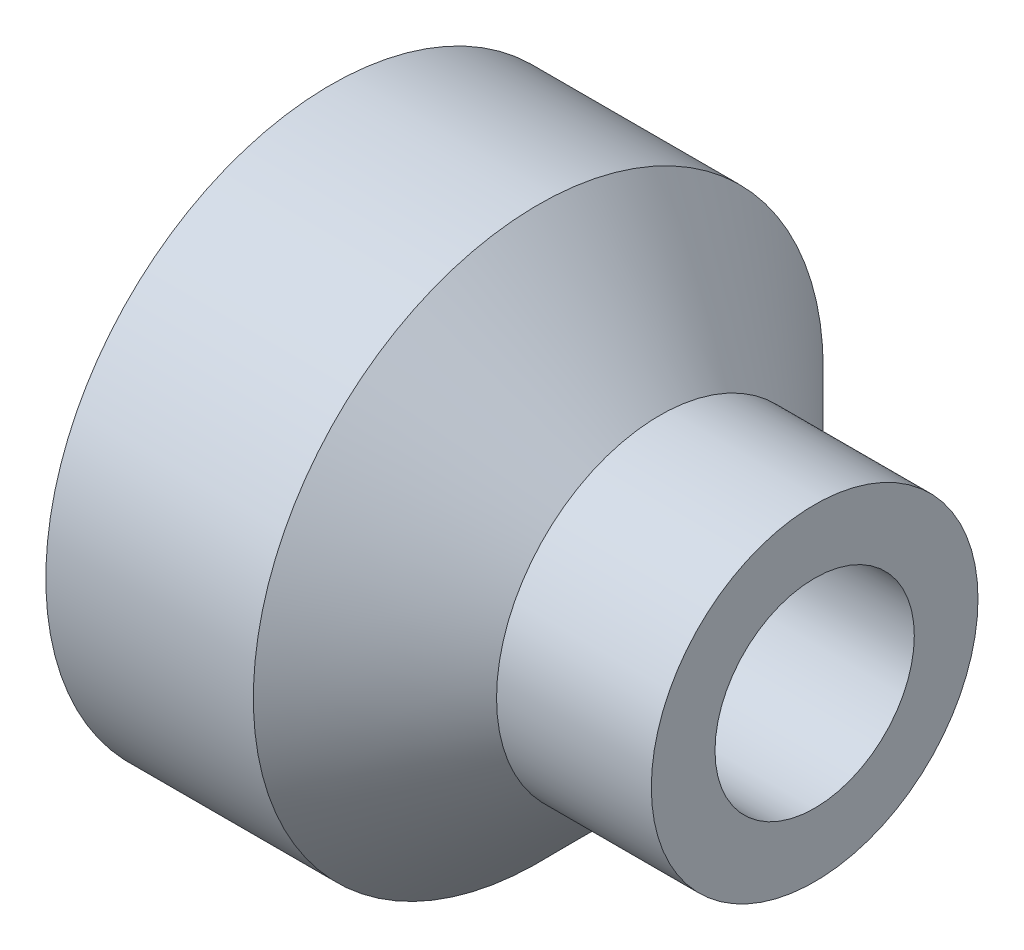
ISO-10303-21;
HEADER;
FILE_DESCRIPTION(('STEP AP214'),'2;1');
FILE_NAME('part.step','',(''),(''),'','','');
FILE_SCHEMA(('AUTOMOTIVE_DESIGN { 1 0 10303 214 1 1 1 1 }'));
ENDSEC;
DATA;
#1=APPLICATION_CONTEXT('core data for automotive mechanical design processes');
#2=APPLICATION_PROTOCOL_DEFINITION('international standard','automotive_design',2000,#1);
#3=PRODUCT_CONTEXT('',#1,'mechanical');
#4=PRODUCT('Part','Part','',(#3));
#5=PRODUCT_RELATED_PRODUCT_CATEGORY('part','',(#4));
#6=PRODUCT_DEFINITION_FORMATION('','',#4);
#7=PRODUCT_DEFINITION_CONTEXT('part definition',#1,'design');
#8=PRODUCT_DEFINITION('design','',#6,#7);
#9=PRODUCT_DEFINITION_SHAPE('','',#8);
#10=(LENGTH_UNIT() NAMED_UNIT(*) SI_UNIT(.MILLI.,.METRE.));
#11=(NAMED_UNIT(*) PLANE_ANGLE_UNIT() SI_UNIT($,.RADIAN.));
#12=(NAMED_UNIT(*) SI_UNIT($,.STERADIAN.) SOLID_ANGLE_UNIT());
#13=UNCERTAINTY_MEASURE_WITH_UNIT(LENGTH_MEASURE(1.E-05),#10,'distance_accuracy_value','');
#14=(GEOMETRIC_REPRESENTATION_CONTEXT(3) GLOBAL_UNCERTAINTY_ASSIGNED_CONTEXT((#13)) GLOBAL_UNIT_ASSIGNED_CONTEXT((#10,
#11,#12)) REPRESENTATION_CONTEXT('',''));
#15=CARTESIAN_POINT('',(0.,0.,0.));
#16=DIRECTION('',(0.,0.,1.));
#17=DIRECTION('',(1.,0.,0.));
#18=AXIS2_PLACEMENT_3D('',#15,#16,#17);
#19=CARTESIAN_POINT('',(-3.56242048968553,3.53,0.));
#20=DIRECTION('',(-1.,0.,0.));
#21=DIRECTION('',(0.,0.,1.));
#22=AXIS2_PLACEMENT_3D('',#19,#20,#21);
#23=PLANE('',#22);
#24=CARTESIAN_POINT('',(-3.56242048968553,0.,0.));
#25=DIRECTION('',(1.,0.,0.));
#26=DIRECTION('',(0.,0.,-1.));
#27=AXIS2_PLACEMENT_3D('',#24,#25,#26);
#28=CIRCLE('',#27,3.53);
#29=CARTESIAN_POINT('',(-3.56242048968553,0.,-3.53));
#30=VERTEX_POINT('',#29);
#31=EDGE_CURVE('E72',#30,#30,#28,.T.);
#32=ORIENTED_EDGE('',*,*,#31,.T.);
#33=EDGE_LOOP('',(#32));
#34=FACE_BOUND('',#33,.T.);
#35=CARTESIAN_POINT('',(-3.56242048968553,0.,0.));
#36=DIRECTION('',(1.,0.,0.));
#37=DIRECTION('',(0.,0.,-1.));
#38=AXIS2_PLACEMENT_3D('',#35,#36,#37);
#39=CIRCLE('',#38,4.546);
#40=CARTESIAN_POINT('',(-3.56242048968553,0.,-4.546));
#41=VERTEX_POINT('',#40);
#42=EDGE_CURVE('E10',#41,#41,#39,.T.);
#43=ORIENTED_EDGE('',*,*,#42,.F.);
#44=EDGE_LOOP('',(#43));
#45=FACE_BOUND('',#44,.T.);
#46=ADVANCED_FACE('F37',(#34,#45),#23,.T.);
#47=CARTESIAN_POINT('',(0.,0.,0.));
#48=DIRECTION('',(1.,0.,0.));
#49=DIRECTION('',(0.,0.,-1.));
#50=AXIS2_PLACEMENT_3D('',#47,#48,#49);
#51=CYLINDRICAL_SURFACE('',#50,4.546);
#52=ORIENTED_EDGE('',*,*,#42,.T.);
#53=EDGE_LOOP('',(#52));
#54=FACE_BOUND('',#53,.T.);
#55=CARTESIAN_POINT('',(-0.251579510314462,0.,0.));
#56=DIRECTION('',(1.,0.,0.));
#57=DIRECTION('',(0.,0.,-1.));
#58=AXIS2_PLACEMENT_3D('',#55,#56,#57);
#59=CIRCLE('',#58,4.546);
#60=CARTESIAN_POINT('',(-0.251579510314462,0.,-4.546));
#61=VERTEX_POINT('',#60);
#62=EDGE_CURVE('E44',#61,#61,#59,.T.);
#63=ORIENTED_EDGE('',*,*,#62,.F.);
#64=EDGE_LOOP('',(#63));
#65=FACE_BOUND('',#64,.T.);
#66=ADVANCED_FACE('F91',(#54,#65),#51,.T.);
#67=CARTESIAN_POINT('',(1.68842048968553,0.,0.));
#68=DIRECTION('',(-1.,0.,0.));
#69=DIRECTION('',(0.,0.,1.));
#70=AXIS2_PLACEMENT_3D('',#67,#68,#69);
#71=CONICAL_SURFACE('',#70,2.606,0.78539816339745);
#72=ORIENTED_EDGE('',*,*,#62,.T.);
#73=EDGE_LOOP('',(#72));
#74=FACE_BOUND('',#73,.T.);
#75=CARTESIAN_POINT('',(1.68842048968553,0.,0.));
#76=DIRECTION('',(1.,0.,0.));
#77=DIRECTION('',(0.,0.,-1.));
#78=AXIS2_PLACEMENT_3D('',#75,#76,#77);
#79=CIRCLE('',#78,2.606);
#80=CARTESIAN_POINT('',(1.68842048968553,0.,-2.606));
#81=VERTEX_POINT('',#80);
#82=EDGE_CURVE('E49',#81,#81,#79,.T.);
#83=ORIENTED_EDGE('',*,*,#82,.F.);
#84=EDGE_LOOP('',(#83));
#85=FACE_BOUND('',#84,.T.);
#86=ADVANCED_FACE('F95',(#74,#85),#71,.T.);
#87=CARTESIAN_POINT('',(0.,0.,0.));
#88=DIRECTION('',(1.,0.,0.));
#89=DIRECTION('',(0.,0.,-1.));
#90=AXIS2_PLACEMENT_3D('',#87,#88,#89);
#91=CYLINDRICAL_SURFACE('',#90,2.606);
#92=ORIENTED_EDGE('',*,*,#82,.T.);
#93=EDGE_LOOP('',(#92));
#94=FACE_BOUND('',#93,.T.);
#95=CARTESIAN_POINT('',(4.15757951031446,0.,0.));
#96=DIRECTION('',(1.,0.,0.));
#97=DIRECTION('',(0.,0.,-1.));
#98=AXIS2_PLACEMENT_3D('',#95,#96,#97);
#99=CIRCLE('',#98,2.606);
#100=CARTESIAN_POINT('',(4.15757951031446,0.,-2.606));
#101=VERTEX_POINT('',#100);
#102=EDGE_CURVE('E54',#101,#101,#99,.T.);
#103=ORIENTED_EDGE('',*,*,#102,.F.);
#104=EDGE_LOOP('',(#103));
#105=FACE_BOUND('',#104,.T.);
#106=ADVANCED_FACE('F99',(#94,#105),#91,.T.);
#107=CARTESIAN_POINT('',(4.15757951031446,2.606,0.));
#108=DIRECTION('',(1.,0.,0.));
#109=DIRECTION('',(0.,0.,-1.));
#110=AXIS2_PLACEMENT_3D('',#107,#108,#109);
#111=PLANE('',#110);
#112=ORIENTED_EDGE('',*,*,#102,.T.);
#113=EDGE_LOOP('',(#112));
#114=FACE_BOUND('',#113,.T.);
#115=CARTESIAN_POINT('',(4.15757951031446,0.,0.));
#116=DIRECTION('',(1.,0.,0.));
#117=DIRECTION('',(0.,0.,-1.));
#118=AXIS2_PLACEMENT_3D('',#115,#116,#117);
#119=CIRCLE('',#118,1.59);
#120=CARTESIAN_POINT('',(4.15757951031446,0.,-1.59));
#121=VERTEX_POINT('',#120);
#122=EDGE_CURVE('E60',#121,#121,#119,.T.);
#123=ORIENTED_EDGE('',*,*,#122,.F.);
#124=EDGE_LOOP('',(#123));
#125=FACE_BOUND('',#124,.T.);
#126=ADVANCED_FACE('F105',(#114,#125),#111,.T.);
#127=CARTESIAN_POINT('',(0.,0.,0.));
#128=DIRECTION('',(1.,0.,0.));
#129=DIRECTION('',(0.,0.,-1.));
#130=AXIS2_PLACEMENT_3D('',#127,#128,#129);
#131=CYLINDRICAL_SURFACE('',#130,1.59);
#132=ORIENTED_EDGE('',*,*,#122,.T.);
#133=EDGE_LOOP('',(#132));
#134=FACE_BOUND('',#133,.T.);
#135=CARTESIAN_POINT('',(1.26757951031447,0.,0.));
#136=DIRECTION('',(1.,0.,0.));
#137=DIRECTION('',(0.,0.,-1.));
#138=AXIS2_PLACEMENT_3D('',#135,#136,#137);
#139=CIRCLE('',#138,1.59);
#140=CARTESIAN_POINT('',(1.26757951031447,0.,-1.59));
#141=VERTEX_POINT('',#140);
#142=EDGE_CURVE('E64',#141,#141,#139,.T.);
#143=ORIENTED_EDGE('',*,*,#142,.F.);
#144=EDGE_LOOP('',(#143));
#145=FACE_BOUND('',#144,.T.);
#146=ADVANCED_FACE('F87',(#134,#145),#131,.F.);
#147=CARTESIAN_POINT('',(-0.672420489685528,0.,0.));
#148=DIRECTION('',(-1.,0.,0.));
#149=DIRECTION('',(0.,0.,1.));
#150=AXIS2_PLACEMENT_3D('',#147,#148,#149);
#151=CONICAL_SURFACE('',#150,3.53,0.78539816339745);
#152=ORIENTED_EDGE('',*,*,#142,.T.);
#153=EDGE_LOOP('',(#152));
#154=FACE_BOUND('',#153,.T.);
#155=CARTESIAN_POINT('',(-0.672420489685528,0.,0.));
#156=DIRECTION('',(1.,0.,0.));
#157=DIRECTION('',(0.,0.,-1.));
#158=AXIS2_PLACEMENT_3D('',#155,#156,#157);
#159=CIRCLE('',#158,3.53);
#160=CARTESIAN_POINT('',(-0.672420489685528,0.,-3.53));
#161=VERTEX_POINT('',#160);
#162=EDGE_CURVE('E68',#161,#161,#159,.T.);
#163=ORIENTED_EDGE('',*,*,#162,.F.);
#164=EDGE_LOOP('',(#163));
#165=FACE_BOUND('',#164,.T.);
#166=ADVANCED_FACE('F81',(#154,#165),#151,.F.);
#167=CARTESIAN_POINT('',(0.,0.,0.));
#168=DIRECTION('',(1.,0.,0.));
#169=DIRECTION('',(0.,0.,-1.));
#170=AXIS2_PLACEMENT_3D('',#167,#168,#169);
#171=CYLINDRICAL_SURFACE('',#170,3.53);
#172=ORIENTED_EDGE('',*,*,#162,.T.);
#173=EDGE_LOOP('',(#172));
#174=FACE_BOUND('',#173,.T.);
#175=ORIENTED_EDGE('',*,*,#31,.F.);
#176=EDGE_LOOP('',(#175));
#177=FACE_BOUND('',#176,.T.);
#178=ADVANCED_FACE('F79',(#174,#177),#171,.F.);
#179=CLOSED_SHELL('',(#46,#66,#86,#106,#126,#146,#166,#178));
#180=MANIFOLD_SOLID_BREP('B2',#179);
#181=ADVANCED_BREP_SHAPE_REPRESENTATION('',(#18,#180),#14);
#182=SHAPE_DEFINITION_REPRESENTATION(#9,#181);
ENDSEC;
END-ISO-10303-21;
